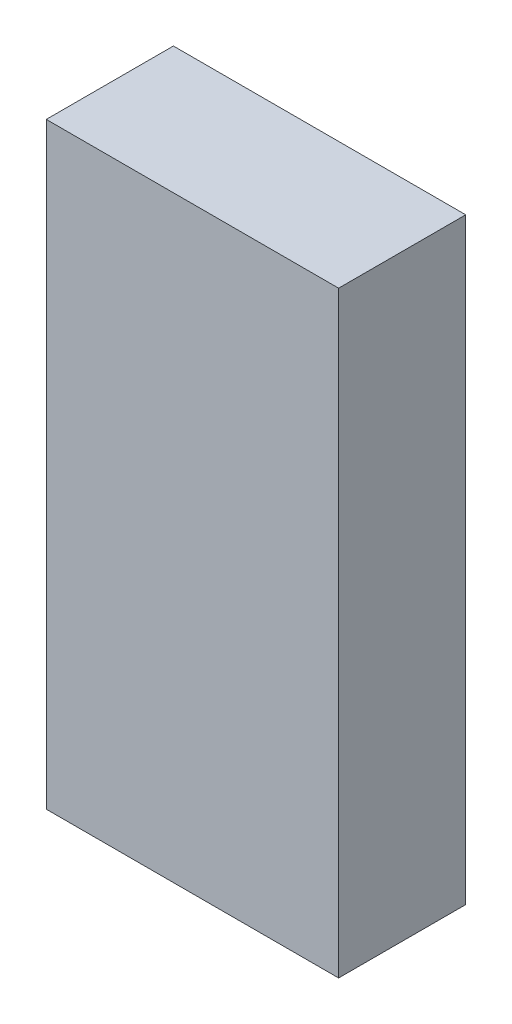
ISO-10303-21;
HEADER;
FILE_DESCRIPTION(('STEP AP214'),'2;1');
FILE_NAME('part.step','',(''),(''),'','','');
FILE_SCHEMA(('AUTOMOTIVE_DESIGN { 1 0 10303 214 1 1 1 1 }'));
ENDSEC;
DATA;
#1=APPLICATION_CONTEXT('core data for automotive mechanical design processes');
#2=APPLICATION_PROTOCOL_DEFINITION('international standard','automotive_design',2000,#1);
#3=PRODUCT_CONTEXT('',#1,'mechanical');
#4=PRODUCT('Part','Part','',(#3));
#5=PRODUCT_RELATED_PRODUCT_CATEGORY('part','',(#4));
#6=PRODUCT_DEFINITION_FORMATION('','',#4);
#7=PRODUCT_DEFINITION_CONTEXT('part definition',#1,'design');
#8=PRODUCT_DEFINITION('design','',#6,#7);
#9=PRODUCT_DEFINITION_SHAPE('','',#8);
#10=(LENGTH_UNIT() NAMED_UNIT(*) SI_UNIT(.MILLI.,.METRE.));
#11=(NAMED_UNIT(*) PLANE_ANGLE_UNIT() SI_UNIT($,.RADIAN.));
#12=(NAMED_UNIT(*) SI_UNIT($,.STERADIAN.) SOLID_ANGLE_UNIT());
#13=UNCERTAINTY_MEASURE_WITH_UNIT(LENGTH_MEASURE(1.E-05),#10,'distance_accuracy_value','');
#14=(GEOMETRIC_REPRESENTATION_CONTEXT(3) GLOBAL_UNCERTAINTY_ASSIGNED_CONTEXT((#13)) GLOBAL_UNIT_ASSIGNED_CONTEXT((#10,
#11,#12)) REPRESENTATION_CONTEXT('',''));
#15=CARTESIAN_POINT('',(0.,0.,0.));
#16=DIRECTION('',(0.,0.,1.));
#17=DIRECTION('',(1.,0.,0.));
#18=AXIS2_PLACEMENT_3D('',#15,#16,#17);
#19=CARTESIAN_POINT('',(57.5,117.5,50.));
#20=DIRECTION('',(-1.,0.,0.));
#21=DIRECTION('',(0.,-1.,0.));
#22=AXIS2_PLACEMENT_3D('',#19,#20,#21);
#23=PLANE('',#22);
#24=DIRECTION('',(0.,1.,0.));
#25=VECTOR('',#24,1.);
#26=CARTESIAN_POINT('',(57.5,117.5,0.));
#27=LINE('',#26,#25);
#28=CARTESIAN_POINT('',(57.5,-117.5,0.));
#29=VERTEX_POINT('',#28);
#30=CARTESIAN_POINT('',(57.5,117.5,0.));
#31=VERTEX_POINT('',#30);
#32=EDGE_CURVE('E96',#29,#31,#27,.T.);
#33=ORIENTED_EDGE('',*,*,#32,.T.);
#34=DIRECTION('',(0.,0.,-1.));
#35=VECTOR('',#34,1.);
#36=CARTESIAN_POINT('',(57.5,117.5,50.));
#37=LINE('',#36,#35);
#38=CARTESIAN_POINT('',(57.5,117.5,50.));
#39=VERTEX_POINT('',#38);
#40=EDGE_CURVE('E11',#39,#31,#37,.T.);
#41=ORIENTED_EDGE('',*,*,#40,.F.);
#42=DIRECTION('',(0.,1.,0.));
#43=VECTOR('',#42,1.);
#44=CARTESIAN_POINT('',(57.5,117.5,50.));
#45=LINE('',#44,#43);
#46=CARTESIAN_POINT('',(57.5,-117.5,50.));
#47=VERTEX_POINT('',#46);
#48=EDGE_CURVE('E84',#47,#39,#45,.T.);
#49=ORIENTED_EDGE('',*,*,#48,.F.);
#50=DIRECTION('',(0.,0.,-1.));
#51=VECTOR('',#50,1.);
#52=CARTESIAN_POINT('',(57.5,-117.5,50.));
#53=LINE('',#52,#51);
#54=EDGE_CURVE('E92',#47,#29,#53,.T.);
#55=ORIENTED_EDGE('',*,*,#54,.T.);
#56=EDGE_LOOP('',(#33,#41,#49,#55));
#57=FACE_BOUND('',#56,.T.);
#58=ADVANCED_FACE('F33',(#57),#23,.F.);
#59=CARTESIAN_POINT('',(-57.5,117.5,50.));
#60=DIRECTION('',(0.,-1.,0.));
#61=DIRECTION('',(0.,0.,-1.));
#62=AXIS2_PLACEMENT_3D('',#59,#60,#61);
#63=PLANE('',#62);
#64=DIRECTION('',(-1.,0.,0.));
#65=VECTOR('',#64,1.);
#66=CARTESIAN_POINT('',(-57.5,117.5,0.));
#67=LINE('',#66,#65);
#68=CARTESIAN_POINT('',(-57.5,117.5,0.));
#69=VERTEX_POINT('',#68);
#70=EDGE_CURVE('E88',#31,#69,#67,.T.);
#71=ORIENTED_EDGE('',*,*,#70,.T.);
#72=DIRECTION('',(0.,0.,-1.));
#73=VECTOR('',#72,1.);
#74=CARTESIAN_POINT('',(-57.5,117.5,50.));
#75=LINE('',#74,#73);
#76=CARTESIAN_POINT('',(-57.5,117.5,50.));
#77=VERTEX_POINT('',#76);
#78=EDGE_CURVE('E41',#77,#69,#75,.T.);
#79=ORIENTED_EDGE('',*,*,#78,.F.);
#80=DIRECTION('',(-1.,0.,0.));
#81=VECTOR('',#80,1.);
#82=CARTESIAN_POINT('',(-57.5,117.5,50.));
#83=LINE('',#82,#81);
#84=EDGE_CURVE('E79',#39,#77,#83,.T.);
#85=ORIENTED_EDGE('',*,*,#84,.F.);
#86=ORIENTED_EDGE('',*,*,#40,.T.);
#87=EDGE_LOOP('',(#71,#79,#85,#86));
#88=FACE_BOUND('',#87,.T.);
#89=ADVANCED_FACE('F87',(#88),#63,.F.);
#90=CARTESIAN_POINT('',(-57.5,117.5,50.));
#91=DIRECTION('',(1.,0.,0.));
#92=DIRECTION('',(0.,1.,0.));
#93=AXIS2_PLACEMENT_3D('',#90,#91,#92);
#94=PLANE('',#93);
#95=DIRECTION('',(0.,-1.,0.));
#96=VECTOR('',#95,1.);
#97=CARTESIAN_POINT('',(-57.5,117.5,0.));
#98=LINE('',#97,#96);
#99=CARTESIAN_POINT('',(-57.5,-117.5,0.));
#100=VERTEX_POINT('',#99);
#101=EDGE_CURVE('E66',#69,#100,#98,.T.);
#102=ORIENTED_EDGE('',*,*,#101,.T.);
#103=DIRECTION('',(0.,0.,-1.));
#104=VECTOR('',#103,1.);
#105=CARTESIAN_POINT('',(-57.5,-117.5,50.));
#106=LINE('',#105,#104);
#107=CARTESIAN_POINT('',(-57.5,-117.5,50.));
#108=VERTEX_POINT('',#107);
#109=EDGE_CURVE('E89',#108,#100,#106,.T.);
#110=ORIENTED_EDGE('',*,*,#109,.F.);
#111=DIRECTION('',(0.,-1.,0.));
#112=VECTOR('',#111,1.);
#113=CARTESIAN_POINT('',(-57.5,117.5,50.));
#114=LINE('',#113,#112);
#115=EDGE_CURVE('E82',#77,#108,#114,.T.);
#116=ORIENTED_EDGE('',*,*,#115,.F.);
#117=ORIENTED_EDGE('',*,*,#78,.T.);
#118=EDGE_LOOP('',(#102,#110,#116,#117));
#119=FACE_BOUND('',#118,.T.);
#120=ADVANCED_FACE('F90',(#119),#94,.F.);
#121=CARTESIAN_POINT('',(-57.5,-117.5,50.));
#122=DIRECTION('',(0.,1.,0.));
#123=DIRECTION('',(0.,0.,1.));
#124=AXIS2_PLACEMENT_3D('',#121,#122,#123);
#125=PLANE('',#124);
#126=DIRECTION('',(1.,0.,0.));
#127=VECTOR('',#126,1.);
#128=CARTESIAN_POINT('',(-57.5,-117.5,0.));
#129=LINE('',#128,#127);
#130=EDGE_CURVE('E72',#100,#29,#129,.T.);
#131=ORIENTED_EDGE('',*,*,#130,.T.);
#132=ORIENTED_EDGE('',*,*,#54,.F.);
#133=DIRECTION('',(1.,0.,0.));
#134=VECTOR('',#133,1.);
#135=CARTESIAN_POINT('',(-57.5,-117.5,50.));
#136=LINE('',#135,#134);
#137=EDGE_CURVE('E49',#108,#47,#136,.T.);
#138=ORIENTED_EDGE('',*,*,#137,.F.);
#139=ORIENTED_EDGE('',*,*,#109,.T.);
#140=EDGE_LOOP('',(#131,#132,#138,#139));
#141=FACE_BOUND('',#140,.T.);
#142=ADVANCED_FACE('F103',(#141),#125,.F.);
#143=CARTESIAN_POINT('',(57.5,-117.5,50.));
#144=DIRECTION('',(0.,0.,1.));
#145=DIRECTION('',(1.,0.,0.));
#146=AXIS2_PLACEMENT_3D('',#143,#144,#145);
#147=PLANE('',#146);
#148=ORIENTED_EDGE('',*,*,#48,.T.);
#149=ORIENTED_EDGE('',*,*,#84,.T.);
#150=ORIENTED_EDGE('',*,*,#115,.T.);
#151=ORIENTED_EDGE('',*,*,#137,.T.);
#152=EDGE_LOOP('',(#148,#149,#150,#151));
#153=FACE_BOUND('',#152,.T.);
#154=ADVANCED_FACE('F80',(#153),#147,.T.);
#155=CARTESIAN_POINT('',(57.5,-117.5,0.));
#156=DIRECTION('',(0.,0.,1.));
#157=DIRECTION('',(1.,0.,0.));
#158=AXIS2_PLACEMENT_3D('',#155,#156,#157);
#159=PLANE('',#158);
#160=ORIENTED_EDGE('',*,*,#32,.F.);
#161=ORIENTED_EDGE('',*,*,#130,.F.);
#162=ORIENTED_EDGE('',*,*,#101,.F.);
#163=ORIENTED_EDGE('',*,*,#70,.F.);
#164=EDGE_LOOP('',(#160,#161,#162,#163));
#165=FACE_BOUND('',#164,.T.);
#166=ADVANCED_FACE('F106',(#165),#159,.F.);
#167=CLOSED_SHELL('',(#58,#89,#120,#142,#154,#166));
#168=MANIFOLD_SOLID_BREP('B2',#167);
#169=ADVANCED_BREP_SHAPE_REPRESENTATION('',(#18,#168),#14);
#170=SHAPE_DEFINITION_REPRESENTATION(#9,#169);
ENDSEC;
END-ISO-10303-21;
